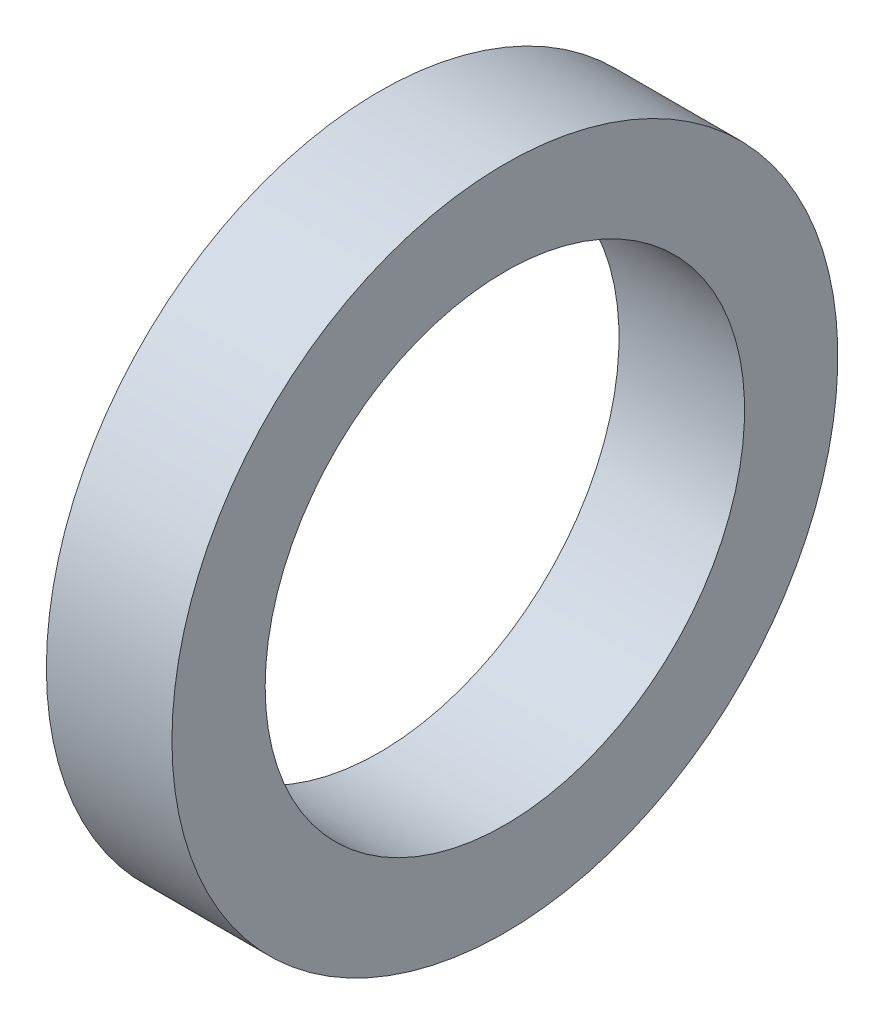
ISO-10303-21;
HEADER;
FILE_DESCRIPTION(('STEP AP214'),'2;1');
FILE_NAME('part.step','',(''),(''),'','','');
FILE_SCHEMA(('AUTOMOTIVE_DESIGN { 1 0 10303 214 1 1 1 1 }'));
ENDSEC;
DATA;
#1=APPLICATION_CONTEXT('core data for automotive mechanical design processes');
#2=APPLICATION_PROTOCOL_DEFINITION('international standard','automotive_design',2000,#1);
#3=PRODUCT_CONTEXT('',#1,'mechanical');
#4=PRODUCT('Part','Part','',(#3));
#5=PRODUCT_RELATED_PRODUCT_CATEGORY('part','',(#4));
#6=PRODUCT_DEFINITION_FORMATION('','',#4);
#7=PRODUCT_DEFINITION_CONTEXT('part definition',#1,'design');
#8=PRODUCT_DEFINITION('design','',#6,#7);
#9=PRODUCT_DEFINITION_SHAPE('','',#8);
#10=(LENGTH_UNIT() NAMED_UNIT(*) SI_UNIT(.MILLI.,.METRE.));
#11=(NAMED_UNIT(*) PLANE_ANGLE_UNIT() SI_UNIT($,.RADIAN.));
#12=(NAMED_UNIT(*) SI_UNIT($,.STERADIAN.) SOLID_ANGLE_UNIT());
#13=UNCERTAINTY_MEASURE_WITH_UNIT(LENGTH_MEASURE(1.E-05),#10,'distance_accuracy_value','');
#14=(GEOMETRIC_REPRESENTATION_CONTEXT(3) GLOBAL_UNCERTAINTY_ASSIGNED_CONTEXT((#13)) GLOBAL_UNIT_ASSIGNED_CONTEXT((#10,
#11,#12)) REPRESENTATION_CONTEXT('',''));
#15=CARTESIAN_POINT('',(0.,0.,0.));
#16=DIRECTION('',(0.,0.,1.));
#17=DIRECTION('',(1.,0.,0.));
#18=AXIS2_PLACEMENT_3D('',#15,#16,#17);
#19=CARTESIAN_POINT('',(0.,0.,-9.));
#20=DIRECTION('',(1.,0.,0.));
#21=DIRECTION('',(0.,0.,-1.));
#22=AXIS2_PLACEMENT_3D('',#19,#20,#21);
#23=PLANE('',#22);
#24=CARTESIAN_POINT('',(0.,0.,0.));
#25=DIRECTION('',(-1.,0.,0.));
#26=DIRECTION('',(0.,0.,1.));
#27=AXIS2_PLACEMENT_3D('',#24,#25,#26);
#28=CIRCLE('',#27,9.);
#29=CARTESIAN_POINT('',(0.,0.,9.));
#30=VERTEX_POINT('',#29);
#31=EDGE_CURVE('E54',#30,#30,#28,.T.);
#32=ORIENTED_EDGE('',*,*,#31,.F.);
#33=EDGE_LOOP('',(#32));
#34=FACE_BOUND('',#33,.T.);
#35=CARTESIAN_POINT('',(0.,0.,0.));
#36=DIRECTION('',(-1.,0.,0.));
#37=DIRECTION('',(0.,0.,1.));
#38=AXIS2_PLACEMENT_3D('',#35,#36,#37);
#39=CIRCLE('',#38,12.5);
#40=CARTESIAN_POINT('',(0.,0.,12.5));
#41=VERTEX_POINT('',#40);
#42=EDGE_CURVE('E10',#41,#41,#39,.T.);
#43=ORIENTED_EDGE('',*,*,#42,.T.);
#44=EDGE_LOOP('',(#43));
#45=FACE_BOUND('',#44,.T.);
#46=ADVANCED_FACE('F37',(#34,#45),#23,.F.);
#47=CARTESIAN_POINT('',(0.,0.,0.));
#48=DIRECTION('',(-1.,0.,0.));
#49=DIRECTION('',(0.,0.,1.));
#50=AXIS2_PLACEMENT_3D('',#47,#48,#49);
#51=CYLINDRICAL_SURFACE('',#50,12.5);
#52=ORIENTED_EDGE('',*,*,#42,.F.);
#53=EDGE_LOOP('',(#52));
#54=FACE_BOUND('',#53,.T.);
#55=CARTESIAN_POINT('',(4.71428571428572,0.,0.));
#56=DIRECTION('',(-1.,0.,0.));
#57=DIRECTION('',(0.,0.,1.));
#58=AXIS2_PLACEMENT_3D('',#55,#56,#57);
#59=CIRCLE('',#58,12.5);
#60=CARTESIAN_POINT('',(4.71428571428572,0.,12.5));
#61=VERTEX_POINT('',#60);
#62=EDGE_CURVE('E44',#61,#61,#59,.T.);
#63=ORIENTED_EDGE('',*,*,#62,.T.);
#64=EDGE_LOOP('',(#63));
#65=FACE_BOUND('',#64,.T.);
#66=ADVANCED_FACE('F64',(#54,#65),#51,.T.);
#67=CARTESIAN_POINT('',(4.71428571428572,0.,-9.));
#68=DIRECTION('',(-1.,0.,0.));
#69=DIRECTION('',(0.,0.,1.));
#70=AXIS2_PLACEMENT_3D('',#67,#68,#69);
#71=PLANE('',#70);
#72=ORIENTED_EDGE('',*,*,#62,.F.);
#73=EDGE_LOOP('',(#72));
#74=FACE_BOUND('',#73,.T.);
#75=CARTESIAN_POINT('',(4.71428571428572,0.,0.));
#76=DIRECTION('',(-1.,0.,0.));
#77=DIRECTION('',(0.,0.,1.));
#78=AXIS2_PLACEMENT_3D('',#75,#76,#77);
#79=CIRCLE('',#78,9.);
#80=CARTESIAN_POINT('',(4.71428571428572,0.,9.));
#81=VERTEX_POINT('',#80);
#82=EDGE_CURVE('E49',#81,#81,#79,.T.);
#83=ORIENTED_EDGE('',*,*,#82,.T.);
#84=EDGE_LOOP('',(#83));
#85=FACE_BOUND('',#84,.T.);
#86=ADVANCED_FACE('F68',(#74,#85),#71,.F.);
#87=CARTESIAN_POINT('',(0.,0.,0.));
#88=DIRECTION('',(-1.,0.,0.));
#89=DIRECTION('',(0.,0.,1.));
#90=AXIS2_PLACEMENT_3D('',#87,#88,#89);
#91=CYLINDRICAL_SURFACE('',#90,9.);
#92=ORIENTED_EDGE('',*,*,#82,.F.);
#93=EDGE_LOOP('',(#92));
#94=FACE_BOUND('',#93,.T.);
#95=ORIENTED_EDGE('',*,*,#31,.T.);
#96=EDGE_LOOP('',(#95));
#97=FACE_BOUND('',#96,.T.);
#98=ADVANCED_FACE('F61',(#94,#97),#91,.F.);
#99=CLOSED_SHELL('',(#46,#66,#86,#98));
#100=MANIFOLD_SOLID_BREP('B2',#99);
#101=ADVANCED_BREP_SHAPE_REPRESENTATION('',(#18,#100),#14);
#102=SHAPE_DEFINITION_REPRESENTATION(#9,#101);
ENDSEC;
END-ISO-10303-21;
